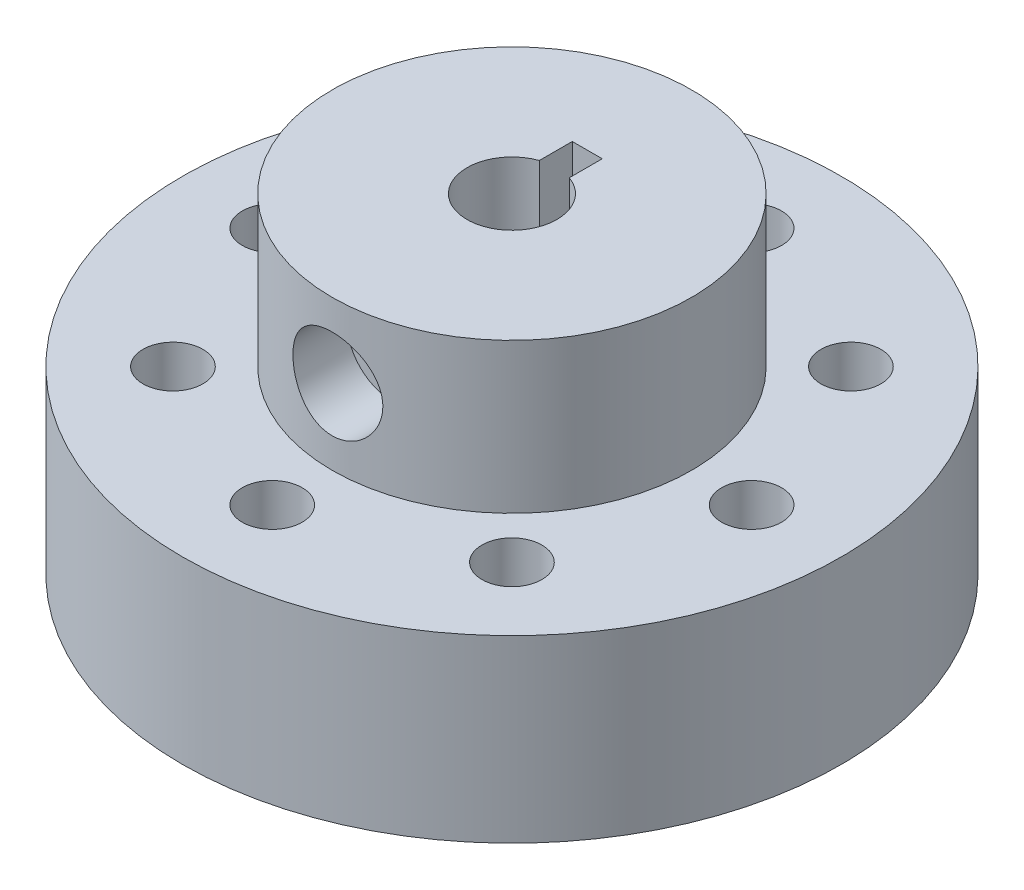
ISO-10303-21;
HEADER;
FILE_DESCRIPTION(('STEP AP214'),'2;1');
FILE_NAME('part.step','',(''),(''),'','','');
FILE_SCHEMA(('AUTOMOTIVE_DESIGN { 1 0 10303 214 1 1 1 1 }'));
ENDSEC;
DATA;
#1=APPLICATION_CONTEXT('core data for automotive mechanical design processes');
#2=APPLICATION_PROTOCOL_DEFINITION('international standard','automotive_design',2000,#1);
#3=PRODUCT_CONTEXT('',#1,'mechanical');
#4=PRODUCT('Part','Part','',(#3));
#5=PRODUCT_RELATED_PRODUCT_CATEGORY('part','',(#4));
#6=PRODUCT_DEFINITION_FORMATION('','',#4);
#7=PRODUCT_DEFINITION_CONTEXT('part definition',#1,'design');
#8=PRODUCT_DEFINITION('design','',#6,#7);
#9=PRODUCT_DEFINITION_SHAPE('','',#8);
#10=(LENGTH_UNIT() NAMED_UNIT(*) SI_UNIT(.MILLI.,.METRE.));
#11=(NAMED_UNIT(*) PLANE_ANGLE_UNIT() SI_UNIT($,.RADIAN.));
#12=(NAMED_UNIT(*) SI_UNIT($,.STERADIAN.) SOLID_ANGLE_UNIT());
#13=UNCERTAINTY_MEASURE_WITH_UNIT(LENGTH_MEASURE(1.E-05),#10,'distance_accuracy_value','');
#14=(GEOMETRIC_REPRESENTATION_CONTEXT(3) GLOBAL_UNCERTAINTY_ASSIGNED_CONTEXT((#13)) GLOBAL_UNIT_ASSIGNED_CONTEXT((#10,
#11,#12)) REPRESENTATION_CONTEXT('',''));
#15=CARTESIAN_POINT('',(0.,0.,0.));
#16=DIRECTION('',(0.,0.,1.));
#17=DIRECTION('',(1.,0.,0.));
#18=AXIS2_PLACEMENT_3D('',#15,#16,#17);
#19=CARTESIAN_POINT('',(0.,8.5,0.));
#20=DIRECTION('',(0.,0.,1.));
#21=DIRECTION('',(1.,0.,0.));
#22=AXIS2_PLACEMENT_3D('',#19,#20,#21);
#23=CYLINDRICAL_SURFACE('',#22,1.);
#24=CARTESIAN_POINT('',(1.,8.5,1.1180339887499));
#25=CARTESIAN_POINT('',(0.999997269988656,8.45118584456569,1.11803876731408));
#26=CARTESIAN_POINT('',(0.99639496251832,8.4023546231456,1.12129035523721));
#27=CARTESIAN_POINT('',(0.982291341588655,8.30644004417459,1.13365986250808));
#28=CARTESIAN_POINT('',(0.971777652939312,8.25935998223522,1.14278830406355));
#29=CARTESIAN_POINT('',(0.94467930838316,8.16863227906116,1.16528292912785));
#30=CARTESIAN_POINT('',(0.92815359007107,8.12495615163117,1.17860780897301));
#31=CARTESIAN_POINT('',(0.889670041967692,8.04106708382667,1.20792047340913));
#32=CARTESIAN_POINT('',(0.867711084060814,8.00085486501176,1.22390881079415));
#33=CARTESIAN_POINT('',(0.815012050038569,7.91817655619155,1.25973036466013));
#34=CARTESIAN_POINT('',(0.783437177258661,7.8763339411414,1.27977468045182));
#35=CARTESIAN_POINT('',(0.714096098703399,7.79799864556286,1.31972413654041));
#36=CARTESIAN_POINT('',(0.6763238658854,7.76151123917074,1.33962912148992));
#37=CARTESIAN_POINT('',(0.589078452471478,7.68967817060917,1.38044409261874));
#38=CARTESIAN_POINT('',(0.538703219829095,7.65525874411216,1.40108392923461));
#39=CARTESIAN_POINT('',(0.431235482106116,7.59567895225496,1.43779242241382));
#40=CARTESIAN_POINT('',(0.374150576160852,7.57050824298441,1.45386618115518));
#41=CARTESIAN_POINT('',(0.261624536740002,7.53322179949127,1.47799953732363));
#42=CARTESIAN_POINT('',(0.206717362590709,7.51995832775222,1.48675587807934));
#43=CARTESIAN_POINT('',(0.0948477243649315,7.50290775535818,1.49804872730961));
#44=CARTESIAN_POINT('',(0.037887940642913,7.49910872038728,1.5005930688118));
#45=CARTESIAN_POINT('',(-0.0670735251161643,7.50108622497453,1.49927680861477));
#46=CARTESIAN_POINT('',(-0.115120319004376,7.50549452565853,1.49633132455064));
#47=CARTESIAN_POINT('',(-0.209619316635507,7.52104552567945,1.4860409139501));
#48=CARTESIAN_POINT('',(-0.256071403824861,7.53218871615177,1.47869566656551));
#49=CARTESIAN_POINT('',(-0.346038968835584,7.56059784239729,1.46026045851868));
#50=CARTESIAN_POINT('',(-0.389565311922981,7.57783944259928,1.44918538991339));
#51=CARTESIAN_POINT('',(-0.473104575326778,7.61777682147641,1.42410552238144));
#52=CARTESIAN_POINT('',(-0.513116852484701,7.64047359575076,1.41010018872581));
#53=CARTESIAN_POINT('',(-0.59414214598172,7.69398936872995,1.37809029225351));
#54=CARTESIAN_POINT('',(-0.634595740498538,7.72548376167639,1.35980204396013));
#55=CARTESIAN_POINT('',(-0.709994037491522,7.79394933974016,1.32200300913499));
#56=CARTESIAN_POINT('',(-0.744930067597284,7.83092897296691,1.30249036407616));
#57=CARTESIAN_POINT('',(-0.813861176630826,7.91598160510664,1.26075022472076));
#58=CARTESIAN_POINT('',(-0.846867965631776,7.96488553985724,1.23857160004468));
#59=CARTESIAN_POINT('',(-0.904174374727408,8.06875491961036,1.19737805415546));
#60=CARTESIAN_POINT('',(-0.928488593274471,8.12370999720697,1.17835785767438));
#61=CARTESIAN_POINT('',(-0.961663622838891,8.22235953103654,1.15131435153449));
#62=CARTESIAN_POINT('',(-0.972953958737704,8.26479668502839,1.1417018228885));
#63=CARTESIAN_POINT('',(-0.989897777900029,8.35151974490846,1.1270451989479));
#64=CARTESIAN_POINT('',(-0.995561034821825,8.39580230558646,1.12199318391119));
#65=CARTESIAN_POINT('',(-1.00089700074453,8.48522149322059,1.11723778493745));
#66=CARTESIAN_POINT('',(-1.00054364876605,8.53036098925948,1.11755766933454));
#67=CARTESIAN_POINT('',(-0.993808148581262,8.6198419169781,1.12354940184257));
#68=CARTESIAN_POINT('',(-0.987421113449807,8.66418267205586,1.12922558823606));
#69=CARTESIAN_POINT('',(-0.969499055937227,8.74869470877286,1.14463988751152));
#70=CARTESIAN_POINT('',(-0.958230872657147,8.78896385449378,1.15416593537715));
#71=CARTESIAN_POINT('',(-0.931115208135283,8.86706311803266,1.17614979263984));
#72=CARTESIAN_POINT('',(-0.915266188999619,8.9048924115095,1.18860858636727));
#73=CARTESIAN_POINT('',(-0.875816733031264,8.98510100188837,1.21805741810736));
#74=CARTESIAN_POINT('',(-0.851300144226032,9.02687840563095,1.23545540768822));
#75=CARTESIAN_POINT('',(-0.796763657645591,9.10620840116497,1.27131257456476));
#76=CARTESIAN_POINT('',(-0.766737059459381,9.14375575832942,1.2897730248931));
#77=CARTESIAN_POINT('',(-0.69438328851265,9.22198117378524,1.33037839141598));
#78=CARTESIAN_POINT('',(-0.650801932557865,9.26155142413784,1.35244726064259));
#79=CARTESIAN_POINT('',(-0.556549744344258,9.33290834145647,1.39387790925842));
#80=CARTESIAN_POINT('',(-0.50588523873168,9.36470188562506,1.41324207395941));
#81=CARTESIAN_POINT('',(-0.408743737408335,9.41394586946146,1.44395410620131));
#82=CARTESIAN_POINT('',(-0.363331182442476,9.4329782522209,1.45612729055242));
#83=CARTESIAN_POINT('',(-0.269378539510947,9.46430359715951,1.47639353933782));
#84=CARTESIAN_POINT('',(-0.220841131929572,9.47660225142969,1.48449004936067));
#85=CARTESIAN_POINT('',(-0.121684696151539,9.49384848191957,1.49589182013302));
#86=CARTESIAN_POINT('',(-0.0710574184621124,9.49876333975339,1.49917575428247));
#87=CARTESIAN_POINT('',(0.0304277732903137,9.5008239257085,1.50054910514547));
#88=CARTESIAN_POINT('',(0.0812856654767084,9.49797037597807,1.49863900469456));
#89=CARTESIAN_POINT('',(0.177878766264063,9.48517025549766,1.49014777988657));
#90=CARTESIAN_POINT('',(0.223717571535267,9.4757545075691,1.48391638604927));
#91=CARTESIAN_POINT('',(0.313009211498526,9.45088099528455,1.46768053103468));
#92=CARTESIAN_POINT('',(0.356461674343442,9.43542229232637,1.45767548373552));
#93=CARTESIAN_POINT('',(0.442573648304174,9.39803064755799,1.43395882743097));
#94=CARTESIAN_POINT('',(0.485041794600131,9.37577484625246,1.42006624473169));
#95=CARTESIAN_POINT('',(0.565776331341589,9.32592467768701,1.38987704117736));
#96=CARTESIAN_POINT('',(0.604040186025008,9.298327116024,1.37357898322632));
#97=CARTESIAN_POINT('',(0.681647111007009,9.23368554883185,1.33696465736197));
#98=CARTESIAN_POINT('',(0.720213397630455,9.19583848816298,1.31641956938685));
#99=CARTESIAN_POINT('',(0.790800111407977,9.11444322922708,1.27526678824743));
#100=CARTESIAN_POINT('',(0.822815641619614,9.07089080558296,1.25465905985077));
#101=CARTESIAN_POINT('',(0.877566267592054,8.98206620462236,1.21692106795149));
#102=CARTESIAN_POINT('',(0.900823234486049,8.93717909502483,1.19964543370952));
#103=CARTESIAN_POINT('',(0.940579011701361,8.84335777550342,1.16873750795511));
#104=CARTESIAN_POINT('',(0.957090951406665,8.79443165306892,1.15509815647652));
#105=CARTESIAN_POINT('',(0.979681312354539,8.70461426578773,1.1359552596477));
#106=CARTESIAN_POINT('',(0.987261141866241,8.66434588160485,1.12931847705076));
#107=CARTESIAN_POINT('',(0.997419579094631,8.58272179974773,1.12035759608004));
#108=CARTESIAN_POINT('',(1.00000231351858,8.54136702786971,1.11802993920738));
#109=CARTESIAN_POINT('',(1.,8.5,1.1180339887499));
#110=B_SPLINE_CURVE_WITH_KNOTS('',3,(#24,#25,#26,#27,#28,#29,#30,#31,#32,#33,#34,#35,#36,#37,
#38,#39,#40,#41,#42,#43,#44,#45,#46,#47,#48,#49,#50,#51,#52,#53,#54,#55,#56,#57,#58,#59,#60,#61,
#62,#63,#64,#65,#66,#67,#68,#69,#70,#71,#72,#73,#74,#75,#76,#77,#78,#79,#80,#81,#82,#83,#84,#85,
#86,#87,#88,#89,#90,#91,#92,#93,#94,#95,#96,#97,#98,#99,#100,#101,#102,#103,#104,#105,#106,#107,
#108,#109),.UNSPECIFIED.,.T.,.F.,(4,2,2,2,2,2,2,2,2,2,2,2,2,2,2,2,2,2,2,2,2,2,2,2,2,2,2,2,2,2,2,
2,2,2,2,2,2,2,2,2,2,2,4),(0.,0.146253465361077,0.292769521129644,0.437886325608138,
0.583033286332745,0.750773385343188,0.918677592181378,1.11083515503145,1.3027771469429,
1.4731874103179,1.64338268344149,1.78769767477871,1.93202319141873,2.07577915986595,
2.219561384515,2.38223762973317,2.54516707398319,2.73339351752472,2.92130234871974,
3.05563045200662,3.18972483117743,3.32440018819018,3.45918471785299,3.58738225853468,
3.71562288822478,3.86949615025543,4.0235577839993,4.21127342259657,4.39882245285466,
4.55035290305024,4.70175506443411,4.85382614632258,5.00588309222248,5.1468839112404,
5.28790663945594,5.43708931492125,5.58636147964719,5.75911103141433,5.93198925208477,
6.09167062897535,6.25103968323788,6.37508308151304,6.49902399831892),.UNSPECIFIED.);
#111=CARTESIAN_POINT('',(1.,8.5,1.1180339887499));
#112=VERTEX_POINT('',#111);
#113=EDGE_CURVE('E127',#112,#112,#110,.T.);
#114=ORIENTED_EDGE('',*,*,#113,.T.);
#115=EDGE_LOOP('',(#114));
#116=FACE_BOUND('',#115,.T.);
#117=CARTESIAN_POINT('',(0.,8.5,4.));
#118=DIRECTION('',(0.,0.,1.));
#119=DIRECTION('',(1.,0.,0.));
#120=AXIS2_PLACEMENT_3D('',#117,#118,#119);
#121=CIRCLE('',#120,1.);
#122=CARTESIAN_POINT('',(1.,8.5,4.));
#123=VERTEX_POINT('',#122);
#124=EDGE_CURVE('E552',#123,#123,#121,.T.);
#125=ORIENTED_EDGE('',*,*,#124,.T.);
#126=EDGE_LOOP('',(#125));
#127=FACE_BOUND('',#126,.T.);
#128=ADVANCED_FACE('F47',(#116,#127),#23,.F.);
#129=CARTESIAN_POINT('',(0.,6.,0.));
#130=DIRECTION('',(0.,1.,0.));
#131=DIRECTION('',(0.,0.,1.));
#132=AXIS2_PLACEMENT_3D('',#129,#130,#131);
#133=PLANE('',#132);
#134=CARTESIAN_POINT('',(0.,6.,0.));
#135=DIRECTION('',(0.,1.,0.));
#136=DIRECTION('',(0.,0.,1.));
#137=AXIS2_PLACEMENT_3D('',#134,#135,#136);
#138=CIRCLE('',#137,6.);
#139=CARTESIAN_POINT('',(0.,6.,6.));
#140=VERTEX_POINT('',#139);
#141=EDGE_CURVE('E119',#140,#140,#138,.T.);
#142=ORIENTED_EDGE('',*,*,#141,.F.);
#143=EDGE_LOOP('',(#142));
#144=FACE_BOUND('',#143,.T.);
#145=CARTESIAN_POINT('',(-7.99999999999966,6.,3.40570654445189E-13));
#146=DIRECTION('',(0.,1.,0.));
#147=DIRECTION('',(0.,0.,1.));
#148=AXIS2_PLACEMENT_3D('',#145,#146,#147);
#149=CIRCLE('',#148,1.0000000000005);
#150=CARTESIAN_POINT('',(-7.99999999999966,6.,1.00000000000085));
#151=VERTEX_POINT('',#150);
#152=EDGE_CURVE('E176',#151,#151,#149,.T.);
#153=ORIENTED_EDGE('',*,*,#152,.F.);
#154=EDGE_LOOP('',(#153));
#155=FACE_BOUND('',#154,.T.);
#156=CARTESIAN_POINT('',(6.79181874011743E-13,6.,8.));
#157=DIRECTION('',(0.,1.,0.));
#158=DIRECTION('',(0.,0.,1.));
#159=AXIS2_PLACEMENT_3D('',#156,#157,#158);
#160=CIRCLE('',#159,1.0000000000007);
#161=CARTESIAN_POINT('',(6.79181874011743E-13,6.,9.0000000000007));
#162=VERTEX_POINT('',#161);
#163=EDGE_CURVE('E192',#162,#162,#160,.T.);
#164=ORIENTED_EDGE('',*,*,#163,.F.);
#165=EDGE_LOOP('',(#164));
#166=FACE_BOUND('',#165,.T.);
#167=CARTESIAN_POINT('',(8.00000000000034,6.,-3.39590937005871E-13));
#168=DIRECTION('',(0.,1.,0.));
#169=DIRECTION('',(0.,0.,1.));
#170=AXIS2_PLACEMENT_3D('',#167,#168,#169);
#171=CIRCLE('',#170,1.00000000000025);
#172=CARTESIAN_POINT('',(8.00000000000034,6.,0.999999999999913));
#173=VERTEX_POINT('',#172);
#174=EDGE_CURVE('E208',#173,#173,#171,.T.);
#175=ORIENTED_EDGE('',*,*,#174,.F.);
#176=EDGE_LOOP('',(#175));
#177=FACE_BOUND('',#176,.T.);
#178=CARTESIAN_POINT('',(0.,6.,-8.));
#179=DIRECTION('',(0.,1.,0.));
#180=DIRECTION('',(0.,0.,1.));
#181=AXIS2_PLACEMENT_3D('',#178,#179,#180);
#182=CIRCLE('',#181,1.);
#183=CARTESIAN_POINT('',(0.,6.,-7.));
#184=VERTEX_POINT('',#183);
#185=EDGE_CURVE('E224',#184,#184,#182,.T.);
#186=ORIENTED_EDGE('',*,*,#185,.F.);
#187=EDGE_LOOP('',(#186));
#188=FACE_BOUND('',#187,.T.);
#189=CARTESIAN_POINT('',(0.,6.,0.));
#190=DIRECTION('',(0.,1.,0.));
#191=DIRECTION('',(0.,0.,1.));
#192=AXIS2_PLACEMENT_3D('',#189,#190,#191);
#193=CIRCLE('',#192,11.);
#194=CARTESIAN_POINT('',(0.,6.,11.));
#195=VERTEX_POINT('',#194);
#196=EDGE_CURVE('E61',#195,#195,#193,.T.);
#197=ORIENTED_EDGE('',*,*,#196,.T.);
#198=EDGE_LOOP('',(#197));
#199=FACE_BOUND('',#198,.T.);
#200=CARTESIAN_POINT('',(5.65685424949248,6.,-5.65685424949262));
#201=DIRECTION('',(0.,1.,0.));
#202=DIRECTION('',(0.,0.,1.));
#203=AXIS2_PLACEMENT_3D('',#200,#201,#202);
#204=CIRCLE('',#203,1.00000000000004);
#205=CARTESIAN_POINT('',(5.65685424949248,6.,-4.65685424949258));
#206=VERTEX_POINT('',#205);
#207=EDGE_CURVE('E216',#206,#206,#204,.T.);
#208=ORIENTED_EDGE('',*,*,#207,.F.);
#209=EDGE_LOOP('',(#208));
#210=FACE_BOUND('',#209,.T.);
#211=CARTESIAN_POINT('',(5.65685424949296,6.,5.65685424949214));
#212=DIRECTION('',(0.,1.,0.));
#213=DIRECTION('',(0.,0.,1.));
#214=AXIS2_PLACEMENT_3D('',#211,#212,#213);
#215=CIRCLE('',#214,1.00000000000052);
#216=CARTESIAN_POINT('',(5.65685424949296,6.,6.65685424949266));
#217=VERTEX_POINT('',#216);
#218=EDGE_CURVE('E200',#217,#217,#215,.T.);
#219=ORIENTED_EDGE('',*,*,#218,.F.);
#220=EDGE_LOOP('',(#219));
#221=FACE_BOUND('',#220,.T.);
#222=CARTESIAN_POINT('',(-5.6568542494918,6.,5.65685424949262));
#223=DIRECTION('',(0.,1.,0.));
#224=DIRECTION('',(0.,0.,1.));
#225=AXIS2_PLACEMENT_3D('',#222,#223,#224);
#226=CIRCLE('',#225,1.00000000000069);
#227=CARTESIAN_POINT('',(-5.6568542494918,6.,6.65685424949331));
#228=VERTEX_POINT('',#227);
#229=EDGE_CURVE('E184',#228,#228,#226,.T.);
#230=ORIENTED_EDGE('',*,*,#229,.F.);
#231=EDGE_LOOP('',(#230));
#232=FACE_BOUND('',#231,.T.);
#233=CARTESIAN_POINT('',(-5.65685424949228,6.,-5.65685424949214));
#234=DIRECTION('',(0.,1.,0.));
#235=DIRECTION('',(0.,0.,1.));
#236=AXIS2_PLACEMENT_3D('',#233,#234,#235);
#237=CIRCLE('',#236,1.00000000000026);
#238=CARTESIAN_POINT('',(-5.65685424949228,6.,-4.65685424949188));
#239=VERTEX_POINT('',#238);
#240=EDGE_CURVE('E168',#239,#239,#237,.T.);
#241=ORIENTED_EDGE('',*,*,#240,.F.);
#242=EDGE_LOOP('',(#241));
#243=FACE_BOUND('',#242,.T.);
#244=ADVANCED_FACE('F243',(#144,#155,#166,#177,#188,#199,#210,#221,#232,#243),#133,.T.);
#245=CARTESIAN_POINT('',(0.,0.,0.));
#246=DIRECTION('',(0.,1.,0.));
#247=DIRECTION('',(0.,0.,1.));
#248=AXIS2_PLACEMENT_3D('',#245,#246,#247);
#249=PLANE('',#248);
#250=CARTESIAN_POINT('',(0.,0.,0.));
#251=DIRECTION('',(0.,-1.,0.));
#252=DIRECTION('',(0.,0.,-1.));
#253=AXIS2_PLACEMENT_3D('',#250,#251,#252);
#254=CIRCLE('',#253,4.);
#255=CARTESIAN_POINT('',(0.,0.,-4.));
#256=VERTEX_POINT('',#255);
#257=EDGE_CURVE('E102',#256,#256,#254,.T.);
#258=ORIENTED_EDGE('',*,*,#257,.F.);
#259=EDGE_LOOP('',(#258));
#260=FACE_BOUND('',#259,.T.);
#261=CARTESIAN_POINT('',(0.,0.,0.));
#262=DIRECTION('',(0.,1.,0.));
#263=DIRECTION('',(0.,0.,1.));
#264=AXIS2_PLACEMENT_3D('',#261,#262,#263);
#265=CIRCLE('',#264,11.);
#266=CARTESIAN_POINT('',(0.,0.,11.));
#267=VERTEX_POINT('',#266);
#268=EDGE_CURVE('E228',#267,#267,#265,.T.);
#269=ORIENTED_EDGE('',*,*,#268,.F.);
#270=EDGE_LOOP('',(#269));
#271=FACE_BOUND('',#270,.T.);
#272=CARTESIAN_POINT('',(0.,0.,-8.));
#273=DIRECTION('',(0.,1.,0.));
#274=DIRECTION('',(0.,0.,1.));
#275=AXIS2_PLACEMENT_3D('',#272,#273,#274);
#276=CIRCLE('',#275,1.);
#277=CARTESIAN_POINT('',(0.,0.,-7.));
#278=VERTEX_POINT('',#277);
#279=EDGE_CURVE('E220',#278,#278,#276,.T.);
#280=ORIENTED_EDGE('',*,*,#279,.T.);
#281=EDGE_LOOP('',(#280));
#282=FACE_BOUND('',#281,.T.);
#283=CARTESIAN_POINT('',(5.65685424949248,0.,-5.65685424949262));
#284=DIRECTION('',(0.,1.,0.));
#285=DIRECTION('',(0.,0.,1.));
#286=AXIS2_PLACEMENT_3D('',#283,#284,#285);
#287=CIRCLE('',#286,1.00000000000004);
#288=CARTESIAN_POINT('',(5.65685424949248,0.,-4.65685424949258));
#289=VERTEX_POINT('',#288);
#290=EDGE_CURVE('E212',#289,#289,#287,.T.);
#291=ORIENTED_EDGE('',*,*,#290,.T.);
#292=EDGE_LOOP('',(#291));
#293=FACE_BOUND('',#292,.T.);
#294=CARTESIAN_POINT('',(8.00000000000034,0.,-3.39590937005871E-13));
#295=DIRECTION('',(0.,1.,0.));
#296=DIRECTION('',(0.,0.,1.));
#297=AXIS2_PLACEMENT_3D('',#294,#295,#296);
#298=CIRCLE('',#297,1.00000000000025);
#299=CARTESIAN_POINT('',(8.00000000000034,0.,0.999999999999913));
#300=VERTEX_POINT('',#299);
#301=EDGE_CURVE('E204',#300,#300,#298,.T.);
#302=ORIENTED_EDGE('',*,*,#301,.T.);
#303=EDGE_LOOP('',(#302));
#304=FACE_BOUND('',#303,.T.);
#305=CARTESIAN_POINT('',(5.65685424949296,0.,5.65685424949214));
#306=DIRECTION('',(0.,1.,0.));
#307=DIRECTION('',(0.,0.,1.));
#308=AXIS2_PLACEMENT_3D('',#305,#306,#307);
#309=CIRCLE('',#308,1.00000000000052);
#310=CARTESIAN_POINT('',(5.65685424949296,0.,6.65685424949266));
#311=VERTEX_POINT('',#310);
#312=EDGE_CURVE('E196',#311,#311,#309,.T.);
#313=ORIENTED_EDGE('',*,*,#312,.T.);
#314=EDGE_LOOP('',(#313));
#315=FACE_BOUND('',#314,.T.);
#316=CARTESIAN_POINT('',(6.79181874011743E-13,0.,8.));
#317=DIRECTION('',(0.,1.,0.));
#318=DIRECTION('',(0.,0.,1.));
#319=AXIS2_PLACEMENT_3D('',#316,#317,#318);
#320=CIRCLE('',#319,1.0000000000007);
#321=CARTESIAN_POINT('',(6.79181874011743E-13,0.,9.0000000000007));
#322=VERTEX_POINT('',#321);
#323=EDGE_CURVE('E188',#322,#322,#320,.T.);
#324=ORIENTED_EDGE('',*,*,#323,.T.);
#325=EDGE_LOOP('',(#324));
#326=FACE_BOUND('',#325,.T.);
#327=CARTESIAN_POINT('',(-5.6568542494918,0.,5.65685424949262));
#328=DIRECTION('',(0.,1.,0.));
#329=DIRECTION('',(0.,0.,1.));
#330=AXIS2_PLACEMENT_3D('',#327,#328,#329);
#331=CIRCLE('',#330,1.00000000000069);
#332=CARTESIAN_POINT('',(-5.6568542494918,0.,6.65685424949331));
#333=VERTEX_POINT('',#332);
#334=EDGE_CURVE('E180',#333,#333,#331,.T.);
#335=ORIENTED_EDGE('',*,*,#334,.T.);
#336=EDGE_LOOP('',(#335));
#337=FACE_BOUND('',#336,.T.);
#338=CARTESIAN_POINT('',(-7.99999999999966,0.,3.40570654445189E-13));
#339=DIRECTION('',(0.,1.,0.));
#340=DIRECTION('',(0.,0.,1.));
#341=AXIS2_PLACEMENT_3D('',#338,#339,#340);
#342=CIRCLE('',#341,1.0000000000005);
#343=CARTESIAN_POINT('',(-7.99999999999966,0.,1.00000000000085));
#344=VERTEX_POINT('',#343);
#345=EDGE_CURVE('E172',#344,#344,#342,.T.);
#346=ORIENTED_EDGE('',*,*,#345,.T.);
#347=EDGE_LOOP('',(#346));
#348=FACE_BOUND('',#347,.T.);
#349=CARTESIAN_POINT('',(-5.65685424949228,0.,-5.65685424949214));
#350=DIRECTION('',(0.,1.,0.));
#351=DIRECTION('',(0.,0.,1.));
#352=AXIS2_PLACEMENT_3D('',#349,#350,#351);
#353=CIRCLE('',#352,1.00000000000026);
#354=CARTESIAN_POINT('',(-5.65685424949228,0.,-4.65685424949188));
#355=VERTEX_POINT('',#354);
#356=EDGE_CURVE('E164',#355,#355,#353,.T.);
#357=ORIENTED_EDGE('',*,*,#356,.T.);
#358=EDGE_LOOP('',(#357));
#359=FACE_BOUND('',#358,.T.);
#360=ADVANCED_FACE('F240',(#260,#271,#282,#293,#304,#315,#326,#337,#348,#359),#249,.F.);
#361=CARTESIAN_POINT('',(0.,6.,0.));
#362=DIRECTION('',(0.,-1.,0.));
#363=DIRECTION('',(0.,0.,-1.));
#364=AXIS2_PLACEMENT_3D('',#361,#362,#363);
#365=CYLINDRICAL_SURFACE('',#364,11.);
#366=ORIENTED_EDGE('',*,*,#196,.F.);
#367=EDGE_LOOP('',(#366));
#368=FACE_BOUND('',#367,.T.);
#369=ORIENTED_EDGE('',*,*,#268,.T.);
#370=EDGE_LOOP('',(#369));
#371=FACE_BOUND('',#370,.T.);
#372=ADVANCED_FACE('F49',(#368,#371),#365,.T.);
#373=CARTESIAN_POINT('',(0.,6.,-8.));
#374=DIRECTION('',(0.,-1.,0.));
#375=DIRECTION('',(0.,0.,-1.));
#376=AXIS2_PLACEMENT_3D('',#373,#374,#375);
#377=CYLINDRICAL_SURFACE('',#376,1.);
#378=ORIENTED_EDGE('',*,*,#185,.T.);
#379=EDGE_LOOP('',(#378));
#380=FACE_BOUND('',#379,.T.);
#381=ORIENTED_EDGE('',*,*,#279,.F.);
#382=EDGE_LOOP('',(#381));
#383=FACE_BOUND('',#382,.T.);
#384=ADVANCED_FACE('F481',(#380,#383),#377,.F.);
#385=CARTESIAN_POINT('',(5.65685424949248,6.,-5.65685424949262));
#386=DIRECTION('',(0.,-1.,0.));
#387=DIRECTION('',(0.,0.,-1.));
#388=AXIS2_PLACEMENT_3D('',#385,#386,#387);
#389=CYLINDRICAL_SURFACE('',#388,1.00000000000004);
#390=ORIENTED_EDGE('',*,*,#207,.T.);
#391=EDGE_LOOP('',(#390));
#392=FACE_BOUND('',#391,.T.);
#393=ORIENTED_EDGE('',*,*,#290,.F.);
#394=EDGE_LOOP('',(#393));
#395=FACE_BOUND('',#394,.T.);
#396=ADVANCED_FACE('F470',(#392,#395),#389,.F.);
#397=CARTESIAN_POINT('',(8.00000000000034,6.,-3.39590937005871E-13));
#398=DIRECTION('',(0.,-1.,0.));
#399=DIRECTION('',(0.,0.,-1.));
#400=AXIS2_PLACEMENT_3D('',#397,#398,#399);
#401=CYLINDRICAL_SURFACE('',#400,1.00000000000025);
#402=ORIENTED_EDGE('',*,*,#174,.T.);
#403=EDGE_LOOP('',(#402));
#404=FACE_BOUND('',#403,.T.);
#405=ORIENTED_EDGE('',*,*,#301,.F.);
#406=EDGE_LOOP('',(#405));
#407=FACE_BOUND('',#406,.T.);
#408=ADVANCED_FACE('F459',(#404,#407),#401,.F.);
#409=CARTESIAN_POINT('',(5.65685424949296,6.,5.65685424949214));
#410=DIRECTION('',(0.,-1.,0.));
#411=DIRECTION('',(0.,0.,-1.));
#412=AXIS2_PLACEMENT_3D('',#409,#410,#411);
#413=CYLINDRICAL_SURFACE('',#412,1.00000000000052);
#414=ORIENTED_EDGE('',*,*,#218,.T.);
#415=EDGE_LOOP('',(#414));
#416=FACE_BOUND('',#415,.T.);
#417=ORIENTED_EDGE('',*,*,#312,.F.);
#418=EDGE_LOOP('',(#417));
#419=FACE_BOUND('',#418,.T.);
#420=ADVANCED_FACE('F448',(#416,#419),#413,.F.);
#421=CARTESIAN_POINT('',(6.79181874011743E-13,6.,8.));
#422=DIRECTION('',(0.,-1.,0.));
#423=DIRECTION('',(0.,0.,-1.));
#424=AXIS2_PLACEMENT_3D('',#421,#422,#423);
#425=CYLINDRICAL_SURFACE('',#424,1.0000000000007);
#426=ORIENTED_EDGE('',*,*,#163,.T.);
#427=EDGE_LOOP('',(#426));
#428=FACE_BOUND('',#427,.T.);
#429=ORIENTED_EDGE('',*,*,#323,.F.);
#430=EDGE_LOOP('',(#429));
#431=FACE_BOUND('',#430,.T.);
#432=ADVANCED_FACE('F437',(#428,#431),#425,.F.);
#433=CARTESIAN_POINT('',(-5.6568542494918,6.,5.65685424949262));
#434=DIRECTION('',(0.,-1.,0.));
#435=DIRECTION('',(0.,0.,-1.));
#436=AXIS2_PLACEMENT_3D('',#433,#434,#435);
#437=CYLINDRICAL_SURFACE('',#436,1.00000000000069);
#438=ORIENTED_EDGE('',*,*,#229,.T.);
#439=EDGE_LOOP('',(#438));
#440=FACE_BOUND('',#439,.T.);
#441=ORIENTED_EDGE('',*,*,#334,.F.);
#442=EDGE_LOOP('',(#441));
#443=FACE_BOUND('',#442,.T.);
#444=ADVANCED_FACE('F274',(#440,#443),#437,.F.);
#445=CARTESIAN_POINT('',(-7.99999999999966,6.,3.40570654445189E-13));
#446=DIRECTION('',(0.,-1.,0.));
#447=DIRECTION('',(0.,0.,-1.));
#448=AXIS2_PLACEMENT_3D('',#445,#446,#447);
#449=CYLINDRICAL_SURFACE('',#448,1.0000000000005);
#450=ORIENTED_EDGE('',*,*,#152,.T.);
#451=EDGE_LOOP('',(#450));
#452=FACE_BOUND('',#451,.T.);
#453=ORIENTED_EDGE('',*,*,#345,.F.);
#454=EDGE_LOOP('',(#453));
#455=FACE_BOUND('',#454,.T.);
#456=ADVANCED_FACE('F264',(#452,#455),#449,.F.);
#457=CARTESIAN_POINT('',(-5.65685424949228,6.,-5.65685424949214));
#458=DIRECTION('',(0.,-1.,0.));
#459=DIRECTION('',(0.,0.,-1.));
#460=AXIS2_PLACEMENT_3D('',#457,#458,#459);
#461=CYLINDRICAL_SURFACE('',#460,1.00000000000026);
#462=ORIENTED_EDGE('',*,*,#240,.T.);
#463=EDGE_LOOP('',(#462));
#464=FACE_BOUND('',#463,.T.);
#465=ORIENTED_EDGE('',*,*,#356,.F.);
#466=EDGE_LOOP('',(#465));
#467=FACE_BOUND('',#466,.T.);
#468=ADVANCED_FACE('F261',(#464,#467),#461,.F.);
#469=CARTESIAN_POINT('',(0.,5.5,0.));
#470=DIRECTION('',(0.,-1.,0.));
#471=DIRECTION('',(0.,0.,-1.));
#472=AXIS2_PLACEMENT_3D('',#469,#470,#471);
#473=CYLINDRICAL_SURFACE('',#472,4.);
#474=CARTESIAN_POINT('',(0.,5.5,0.));
#475=DIRECTION('',(0.,-1.,0.));
#476=DIRECTION('',(0.,0.,-1.));
#477=AXIS2_PLACEMENT_3D('',#474,#475,#476);
#478=CIRCLE('',#477,4.);
#479=CARTESIAN_POINT('',(0.,5.5,-4.));
#480=VERTEX_POINT('',#479);
#481=EDGE_CURVE('E160',#480,#480,#478,.T.);
#482=ORIENTED_EDGE('',*,*,#481,.F.);
#483=EDGE_LOOP('',(#482));
#484=FACE_BOUND('',#483,.T.);
#485=ORIENTED_EDGE('',*,*,#257,.T.);
#486=EDGE_LOOP('',(#485));
#487=FACE_BOUND('',#486,.T.);
#488=ADVANCED_FACE('F263',(#484,#487),#473,.F.);
#489=CARTESIAN_POINT('',(0.,5.5,0.));
#490=DIRECTION('',(0.,-1.,0.));
#491=DIRECTION('',(0.,0.,-1.));
#492=AXIS2_PLACEMENT_3D('',#489,#490,#491);
#493=PLANE('',#492);
#494=ORIENTED_EDGE('',*,*,#481,.T.);
#495=EDGE_LOOP('',(#494));
#496=FACE_BOUND('',#495,.T.);
#497=ADVANCED_FACE('F271',(#496),#493,.T.);
#498=CARTESIAN_POINT('',(0.,11.,0.));
#499=DIRECTION('',(0.,-1.,0.));
#500=DIRECTION('',(0.,0.,-1.));
#501=AXIS2_PLACEMENT_3D('',#498,#499,#500);
#502=CYLINDRICAL_SURFACE('',#501,1.5);
#503=ORIENTED_EDGE('',*,*,#113,.F.);
#504=EDGE_LOOP('',(#503));
#505=FACE_BOUND('',#504,.T.);
#506=CARTESIAN_POINT('',(0.,6.,0.));
#507=DIRECTION('',(0.,1.,0.));
#508=DIRECTION('',(0.,0.,1.));
#509=AXIS2_PLACEMENT_3D('',#506,#507,#508);
#510=CIRCLE('',#509,1.5);
#511=CARTESIAN_POINT('',(-0.5,6.,-1.4142135623731));
#512=VERTEX_POINT('',#511);
#513=CARTESIAN_POINT('',(0.5,6.,-1.4142135623731));
#514=VERTEX_POINT('',#513);
#515=EDGE_CURVE('E99',#512,#514,#510,.T.);
#516=ORIENTED_EDGE('',*,*,#515,.F.);
#517=DIRECTION('',(0.,-1.,0.));
#518=VECTOR('',#517,1.);
#519=CARTESIAN_POINT('',(-0.5,11.,-1.4142135623731));
#520=LINE('',#519,#518);
#521=CARTESIAN_POINT('',(-0.5,11.,-1.4142135623731));
#522=VERTEX_POINT('',#521);
#523=EDGE_CURVE('E92',#522,#512,#520,.T.);
#524=ORIENTED_EDGE('',*,*,#523,.F.);
#525=CARTESIAN_POINT('',(0.,11.,0.));
#526=DIRECTION('',(0.,1.,0.));
#527=DIRECTION('',(0.,0.,1.));
#528=AXIS2_PLACEMENT_3D('',#525,#526,#527);
#529=CIRCLE('',#528,1.5);
#530=CARTESIAN_POINT('',(0.5,11.,-1.4142135623731));
#531=VERTEX_POINT('',#530);
#532=EDGE_CURVE('E97',#522,#531,#529,.T.);
#533=ORIENTED_EDGE('',*,*,#532,.T.);
#534=DIRECTION('',(0.,-1.,0.));
#535=VECTOR('',#534,1.);
#536=CARTESIAN_POINT('',(0.5,11.,-1.4142135623731));
#537=LINE('',#536,#535);
#538=EDGE_CURVE('E143',#531,#514,#537,.T.);
#539=ORIENTED_EDGE('',*,*,#538,.T.);
#540=EDGE_LOOP('',(#516,#524,#533,#539));
#541=FACE_BOUND('',#540,.T.);
#542=ADVANCED_FACE('F94',(#505,#541),#502,.F.);
#543=CARTESIAN_POINT('',(-0.499999999999999,11.,0.));
#544=DIRECTION('',(-1.,0.,0.));
#545=DIRECTION('',(0.,0.,1.));
#546=AXIS2_PLACEMENT_3D('',#543,#544,#545);
#547=PLANE('',#546);
#548=DIRECTION('',(0.,0.,-1.));
#549=VECTOR('',#548,1.);
#550=CARTESIAN_POINT('',(-0.499999999999999,6.,0.));
#551=LINE('',#550,#549);
#552=CARTESIAN_POINT('',(-0.5,6.,-2.5142135623731));
#553=VERTEX_POINT('',#552);
#554=EDGE_CURVE('E68',#512,#553,#551,.T.);
#555=ORIENTED_EDGE('',*,*,#554,.T.);
#556=DIRECTION('',(0.,-1.,0.));
#557=VECTOR('',#556,1.);
#558=CARTESIAN_POINT('',(-0.5,11.,-2.5142135623731));
#559=LINE('',#558,#557);
#560=CARTESIAN_POINT('',(-0.5,11.,-2.5142135623731));
#561=VERTEX_POINT('',#560);
#562=EDGE_CURVE('E103',#561,#553,#559,.T.);
#563=ORIENTED_EDGE('',*,*,#562,.F.);
#564=DIRECTION('',(0.,0.,-1.));
#565=VECTOR('',#564,1.);
#566=CARTESIAN_POINT('',(-0.499999999999999,11.,0.));
#567=LINE('',#566,#565);
#568=EDGE_CURVE('E106',#522,#561,#567,.T.);
#569=ORIENTED_EDGE('',*,*,#568,.F.);
#570=ORIENTED_EDGE('',*,*,#523,.T.);
#571=EDGE_LOOP('',(#555,#563,#569,#570));
#572=FACE_BOUND('',#571,.T.);
#573=ADVANCED_FACE('F107',(#572),#547,.F.);
#574=CARTESIAN_POINT('',(0.,11.,-2.5142135623731));
#575=DIRECTION('',(0.,0.,-1.));
#576=DIRECTION('',(-1.,0.,0.));
#577=AXIS2_PLACEMENT_3D('',#574,#575,#576);
#578=PLANE('',#577);
#579=DIRECTION('',(1.,0.,0.));
#580=VECTOR('',#579,1.);
#581=CARTESIAN_POINT('',(0.,6.,-2.5142135623731));
#582=LINE('',#581,#580);
#583=CARTESIAN_POINT('',(0.5,6.,-2.5142135623731));
#584=VERTEX_POINT('',#583);
#585=EDGE_CURVE('E73',#553,#584,#582,.T.);
#586=ORIENTED_EDGE('',*,*,#585,.T.);
#587=DIRECTION('',(0.,-1.,0.));
#588=VECTOR('',#587,1.);
#589=CARTESIAN_POINT('',(0.5,11.,-2.5142135623731));
#590=LINE('',#589,#588);
#591=CARTESIAN_POINT('',(0.5,11.,-2.5142135623731));
#592=VERTEX_POINT('',#591);
#593=EDGE_CURVE('E154',#592,#584,#590,.T.);
#594=ORIENTED_EDGE('',*,*,#593,.F.);
#595=DIRECTION('',(1.,0.,0.));
#596=VECTOR('',#595,1.);
#597=CARTESIAN_POINT('',(0.,11.,-2.5142135623731));
#598=LINE('',#597,#596);
#599=EDGE_CURVE('E112',#561,#592,#598,.T.);
#600=ORIENTED_EDGE('',*,*,#599,.F.);
#601=ORIENTED_EDGE('',*,*,#562,.T.);
#602=EDGE_LOOP('',(#586,#594,#600,#601));
#603=FACE_BOUND('',#602,.T.);
#604=ADVANCED_FACE('F301',(#603),#578,.F.);
#605=CARTESIAN_POINT('',(0.499999999999999,11.,0.));
#606=DIRECTION('',(-1.,0.,0.));
#607=DIRECTION('',(0.,0.,1.));
#608=AXIS2_PLACEMENT_3D('',#605,#606,#607);
#609=PLANE('',#608);
#610=DIRECTION('',(0.,0.,-1.));
#611=VECTOR('',#610,1.);
#612=CARTESIAN_POINT('',(0.499999999999999,6.,0.));
#613=LINE('',#612,#611);
#614=EDGE_CURVE('E124',#514,#584,#613,.T.);
#615=ORIENTED_EDGE('',*,*,#614,.F.);
#616=ORIENTED_EDGE('',*,*,#538,.F.);
#617=DIRECTION('',(0.,0.,-1.));
#618=VECTOR('',#617,1.);
#619=CARTESIAN_POINT('',(0.499999999999999,11.,0.));
#620=LINE('',#619,#618);
#621=EDGE_CURVE('E117',#531,#592,#620,.T.);
#622=ORIENTED_EDGE('',*,*,#621,.T.);
#623=ORIENTED_EDGE('',*,*,#593,.T.);
#624=EDGE_LOOP('',(#615,#616,#622,#623));
#625=FACE_BOUND('',#624,.T.);
#626=ADVANCED_FACE('F297',(#625),#609,.T.);
#627=CARTESIAN_POINT('',(0.,11.,0.));
#628=DIRECTION('',(0.,-1.,0.));
#629=DIRECTION('',(0.,0.,-1.));
#630=AXIS2_PLACEMENT_3D('',#627,#628,#629);
#631=CYLINDRICAL_SURFACE('',#630,6.);
#632=CARTESIAN_POINT('',(1.5,8.5,5.80947501931113));
#633=CARTESIAN_POINT('',(1.49999764715507,8.41716954944523,5.80947660051185));
#634=CARTESIAN_POINT('',(1.49311574729838,8.3343130607932,5.81126583608348));
#635=CARTESIAN_POINT('',(1.46581387527848,8.17097945309558,5.81821117195949));
#636=CARTESIAN_POINT('',(1.44538602404532,8.09050374731901,5.82336923173088));
#637=CARTESIAN_POINT('',(1.39169471977917,7.93431787708778,5.8364323475758));
#638=CARTESIAN_POINT('',(1.35844783671268,7.8586017067686,5.84433385614245));
#639=CARTESIAN_POINT('',(1.28011268475685,7.71381348847605,5.86198915217285));
#640=CARTESIAN_POINT('',(1.23502391313642,7.64474172275187,5.87174301827101));
#641=CARTESIAN_POINT('',(1.13322505638712,7.51368301284268,5.89224429813367));
#642=CARTESIAN_POINT('',(1.07630213262243,7.45186383978997,5.90300758573818));
#643=CARTESIAN_POINT('',(0.952909238460399,7.3385431633838,5.92417725309178));
#644=CARTESIAN_POINT('',(0.886438376508185,7.28704262462695,5.93458359939834));
#645=CARTESIAN_POINT('',(0.744687120647373,7.19513471942123,5.95404249312349));
#646=CARTESIAN_POINT('',(0.669296745717072,7.15489216710312,5.96307412440355));
#647=CARTESIAN_POINT('',(0.512557910575657,7.08771421350815,5.97858487155591));
#648=CARTESIAN_POINT('',(0.431210331475164,7.06077684885069,5.98506436400607));
#649=CARTESIAN_POINT('',(0.266615255252497,7.02151129925285,5.99462855308908));
#650=CARTESIAN_POINT('',(0.183439631729385,7.00889821340405,5.99777936306589));
#651=CARTESIAN_POINT('',(0.0160972915576616,6.99774497243467,6.00056156464379));
#652=CARTESIAN_POINT('',(-0.0680692767228412,6.99920273667424,6.00019347658022));
#653=CARTESIAN_POINT('',(-0.233028370758581,7.01594491015009,5.99602856972121));
#654=CARTESIAN_POINT('',(-0.3138543234016,7.03092179503231,5.99230801404524));
#655=CARTESIAN_POINT('',(-0.471807371120529,7.0737827620291,5.98194501914912));
#656=CARTESIAN_POINT('',(-0.548934269055657,7.10166753122645,5.97530242439065));
#657=CARTESIAN_POINT('',(-0.69811005525271,7.16980154241224,5.95972505820537));
#658=CARTESIAN_POINT('',(-0.770106764649756,7.21016022679705,5.95077011817032));
#659=CARTESIAN_POINT('',(-0.906413433510733,7.30201340746976,5.9315394228579));
#660=CARTESIAN_POINT('',(-0.970722052628258,7.35350984113637,5.92126343791494));
#661=CARTESIAN_POINT('',(-1.09166105262743,7.46782524518943,5.90018228261712));
#662=CARTESIAN_POINT('',(-1.1480365186128,7.53091293540866,5.88937031715551));
#663=CARTESIAN_POINT('',(-1.24946456394453,7.66575998412415,5.86869026110024));
#664=CARTESIAN_POINT('',(-1.29451661406902,7.7375197476946,5.85882221463582));
#665=CARTESIAN_POINT('',(-1.3721821935339,7.88817402048938,5.84112298098989));
#666=CARTESIAN_POINT('',(-1.40473435045574,7.96710143818792,5.83330190235432));
#667=CARTESIAN_POINT('',(-1.45602843095451,8.12955128084587,5.82071184083974));
#668=CARTESIAN_POINT('',(-1.47477330982936,8.21307271838988,5.81594220486131));
#669=CARTESIAN_POINT('',(-1.49749778319911,8.37997570091387,5.81013213623485));
#670=CARTESIAN_POINT('',(-1.50185428435178,8.46330267599778,5.80899653456189));
#671=CARTESIAN_POINT('',(-1.49671019430933,8.6294931619469,5.81032406088624));
#672=CARTESIAN_POINT('',(-1.48721087870928,8.71235671477075,5.8127868576076));
#673=CARTESIAN_POINT('',(-1.4549552783626,8.87386855897283,5.82094249172736));
#674=CARTESIAN_POINT('',(-1.43241844096905,8.95256363594251,5.82658182140625));
#675=CARTESIAN_POINT('',(-1.37497084900237,9.10505887471101,5.84040430962578));
#676=CARTESIAN_POINT('',(-1.34005862862753,9.1788584554332,5.84858776949168));
#677=CARTESIAN_POINT('',(-1.25806240076193,9.32106476672041,5.86677682255958));
#678=CARTESIAN_POINT('',(-1.21075305230138,9.38933730402586,5.87681501163985));
#679=CARTESIAN_POINT('',(-1.10559043940168,9.51711301768081,5.8975024984303));
#680=CARTESIAN_POINT('',(-1.04773544220816,9.57661474999004,5.90815189637082));
#681=CARTESIAN_POINT('',(-0.921394081477089,9.68668662554257,5.92918441818964));
#682=CARTESIAN_POINT('',(-0.85267792879739,9.73699603752929,5.93955421237101));
#683=CARTESIAN_POINT('',(-0.707554024042013,9.82536152017075,5.95858329968241));
#684=CARTESIAN_POINT('',(-0.631146673436387,9.86341822996492,5.96724268202376));
#685=CARTESIAN_POINT('',(-0.473337302596635,9.92586762071676,5.98182069442989));
#686=CARTESIAN_POINT('',(-0.391976071541821,9.95035857062744,5.98775898013446));
#687=CARTESIAN_POINT('',(-0.226124640478211,9.98527620076505,5.99631176037473));
#688=CARTESIAN_POINT('',(-0.141635047561865,9.99570559524343,5.99892689636045));
#689=CARTESIAN_POINT('',(0.025625289664989,10.0020513843633,6.00051254113217));
#690=CARTESIAN_POINT('',(0.108380740449049,9.99835256364308,5.99957968320012));
#691=CARTESIAN_POINT('',(0.272051244622109,9.9774282590585,5.99438844686135));
#692=CARTESIAN_POINT('',(0.352966352671329,9.96020317748035,5.99013016735643));
#693=CARTESIAN_POINT('',(0.510256553467224,9.91292167034361,5.97878149280944));
#694=CARTESIAN_POINT('',(0.586653741871528,9.88293482002806,5.97170646753999));
#695=CARTESIAN_POINT('',(0.733375579562202,9.81104413147101,5.95546933370076));
#696=CARTESIAN_POINT('',(0.803699461897577,9.76913879099565,5.94630696206604));
#697=CARTESIAN_POINT('',(0.938102892635849,9.67342714900439,5.92660874521999));
#698=CARTESIAN_POINT('',(1.00199248245088,9.61935978563893,5.91604525418417));
#699=CARTESIAN_POINT('',(1.11992253040688,9.5013657220393,5.89485973579863));
#700=CARTESIAN_POINT('',(1.17396048760228,9.43743652585314,5.88423769428834));
#701=CARTESIAN_POINT('',(1.27164303971884,9.300097878698,5.86391213790822));
#702=CARTESIAN_POINT('',(1.31507492916982,9.22653381488106,5.85422945594827));
#703=CARTESIAN_POINT('',(1.3888903449235,9.07291676511595,5.83715933325924));
#704=CARTESIAN_POINT('',(1.41928336463958,8.99286855083989,5.82977022370054));
#705=CARTESIAN_POINT('',(1.46163379284816,8.84413448225993,5.81927863109675));
#706=CARTESIAN_POINT('',(1.47598975589307,8.77616025342421,5.8156299450082));
#707=CARTESIAN_POINT('',(1.4951734388599,8.63879669650006,5.81072757878358));
#708=CARTESIAN_POINT('',(1.50000197155828,8.56940748963241,5.80947369434945));
#709=CARTESIAN_POINT('',(1.5,8.5,5.80947501931113));
#710=B_SPLINE_CURVE_WITH_KNOTS('',3,(#632,#633,#634,#635,#636,#637,#638,#639,#640,#641,#642,
#643,#644,#645,#646,#647,#648,#649,#650,#651,#652,#653,#654,#655,#656,#657,#658,#659,#660,#661,
#662,#663,#664,#665,#666,#667,#668,#669,#670,#671,#672,#673,#674,#675,#676,#677,#678,#679,#680,
#681,#682,#683,#684,#685,#686,#687,#688,#689,#690,#691,#692,#693,#694,#695,#696,#697,#698,#699,
#700,#701,#702,#703,#704,#705,#706,#707,#708,#709),.UNSPECIFIED.,.T.,.F.,(4,2,2,2,2,2,2,2,2,2,2,
2,2,2,2,2,2,2,2,2,2,2,2,2,2,2,2,2,2,2,2,2,2,2,2,2,2,2,4),(0.,0.24823646504168,0.496617444857199,
0.744678436299612,0.99274996053287,1.24574372515786,1.4987611288792,1.75530897838752,
2.01181895908255,2.26313250597208,2.51440889199612,2.76010957613368,3.00582334034872,
3.25375724552667,3.50173431281348,3.75642279943147,4.01112318719881,4.26705859205042,
4.52293920077729,4.7720614485703,5.02116076310281,5.26618443005524,5.5112371285285,
5.76109707515494,6.01099811331026,6.26715198579191,6.52329249431732,6.77755243684157,
7.03176329345423,7.27910067676474,7.52643070426188,7.77242925935826,8.01845883442843,
8.27038257949243,8.52237018939305,8.77905886370806,9.03556032819972,9.24358696306398,
9.45159585059712),.UNSPECIFIED.);
#711=CARTESIAN_POINT('',(1.5,8.5,5.80947501931113));
#712=VERTEX_POINT('',#711);
#713=EDGE_CURVE('E11',#712,#712,#710,.T.);
#714=ORIENTED_EDGE('',*,*,#713,.T.);
#715=EDGE_LOOP('',(#714));
#716=FACE_BOUND('',#715,.T.);
#717=CARTESIAN_POINT('',(0.,11.,0.));
#718=DIRECTION('',(0.,1.,0.));
#719=DIRECTION('',(0.,0.,1.));
#720=AXIS2_PLACEMENT_3D('',#717,#718,#719);
#721=CIRCLE('',#720,6.);
#722=CARTESIAN_POINT('',(0.,11.,6.));
#723=VERTEX_POINT('',#722);
#724=EDGE_CURVE('E139',#723,#723,#721,.T.);
#725=ORIENTED_EDGE('',*,*,#724,.F.);
#726=EDGE_LOOP('',(#725));
#727=FACE_BOUND('',#726,.T.);
#728=ORIENTED_EDGE('',*,*,#141,.T.);
#729=EDGE_LOOP('',(#728));
#730=FACE_BOUND('',#729,.T.);
#731=ADVANCED_FACE('F293',(#716,#727,#730),#631,.T.);
#732=CARTESIAN_POINT('',(0.,11.,0.));
#733=DIRECTION('',(0.,1.,0.));
#734=DIRECTION('',(0.,0.,1.));
#735=AXIS2_PLACEMENT_3D('',#732,#733,#734);
#736=PLANE('',#735);
#737=ORIENTED_EDGE('',*,*,#532,.F.);
#738=ORIENTED_EDGE('',*,*,#568,.T.);
#739=ORIENTED_EDGE('',*,*,#599,.T.);
#740=ORIENTED_EDGE('',*,*,#621,.F.);
#741=EDGE_LOOP('',(#737,#738,#739,#740));
#742=FACE_BOUND('',#741,.T.);
#743=ORIENTED_EDGE('',*,*,#724,.T.);
#744=EDGE_LOOP('',(#743));
#745=FACE_BOUND('',#744,.T.);
#746=ADVANCED_FACE('F114',(#742,#745),#736,.T.);
#747=ORIENTED_EDGE('',*,*,#515,.T.);
#748=ORIENTED_EDGE('',*,*,#614,.T.);
#749=ORIENTED_EDGE('',*,*,#585,.F.);
#750=ORIENTED_EDGE('',*,*,#554,.F.);
#751=EDGE_LOOP('',(#747,#748,#749,#750));
#752=FACE_BOUND('',#751,.T.);
#753=ADVANCED_FACE('F284',(#752),#133,.T.);
#754=CARTESIAN_POINT('',(0.,8.5,4.));
#755=DIRECTION('',(0.,0.,1.));
#756=DIRECTION('',(1.,0.,0.));
#757=AXIS2_PLACEMENT_3D('',#754,#755,#756);
#758=CYLINDRICAL_SURFACE('',#757,1.5);
#759=CARTESIAN_POINT('',(0.,8.5,4.));
#760=DIRECTION('',(0.,0.,1.));
#761=DIRECTION('',(1.,0.,0.));
#762=AXIS2_PLACEMENT_3D('',#759,#760,#761);
#763=CIRCLE('',#762,1.5);
#764=CARTESIAN_POINT('',(1.5,8.5,4.));
#765=VERTEX_POINT('',#764);
#766=EDGE_CURVE('E555',#765,#765,#763,.T.);
#767=ORIENTED_EDGE('',*,*,#766,.F.);
#768=EDGE_LOOP('',(#767));
#769=FACE_BOUND('',#768,.T.);
#770=ORIENTED_EDGE('',*,*,#713,.F.);
#771=EDGE_LOOP('',(#770));
#772=FACE_BOUND('',#771,.T.);
#773=ADVANCED_FACE('F289',(#769,#772),#758,.F.);
#774=CARTESIAN_POINT('',(0.,8.5,4.));
#775=DIRECTION('',(0.,0.,1.));
#776=DIRECTION('',(1.,0.,0.));
#777=AXIS2_PLACEMENT_3D('',#774,#775,#776);
#778=PLANE('',#777);
#779=ORIENTED_EDGE('',*,*,#124,.F.);
#780=EDGE_LOOP('',(#779));
#781=FACE_BOUND('',#780,.T.);
#782=ORIENTED_EDGE('',*,*,#766,.T.);
#783=EDGE_LOOP('',(#782));
#784=FACE_BOUND('',#783,.T.);
#785=ADVANCED_FACE('F356',(#781,#784),#778,.T.);
#786=CLOSED_SHELL('',(#128,#244,#360,#372,#384,#396,#408,#420,#432,#444,#456,#468,#488,#497,
#542,#573,#604,#626,#731,#746,#753,#773,#785));
#787=MANIFOLD_SOLID_BREP('B2',#786);
#788=ADVANCED_BREP_SHAPE_REPRESENTATION('',(#18,#787),#14);
#789=SHAPE_DEFINITION_REPRESENTATION(#9,#788);
ENDSEC;
END-ISO-10303-21;
